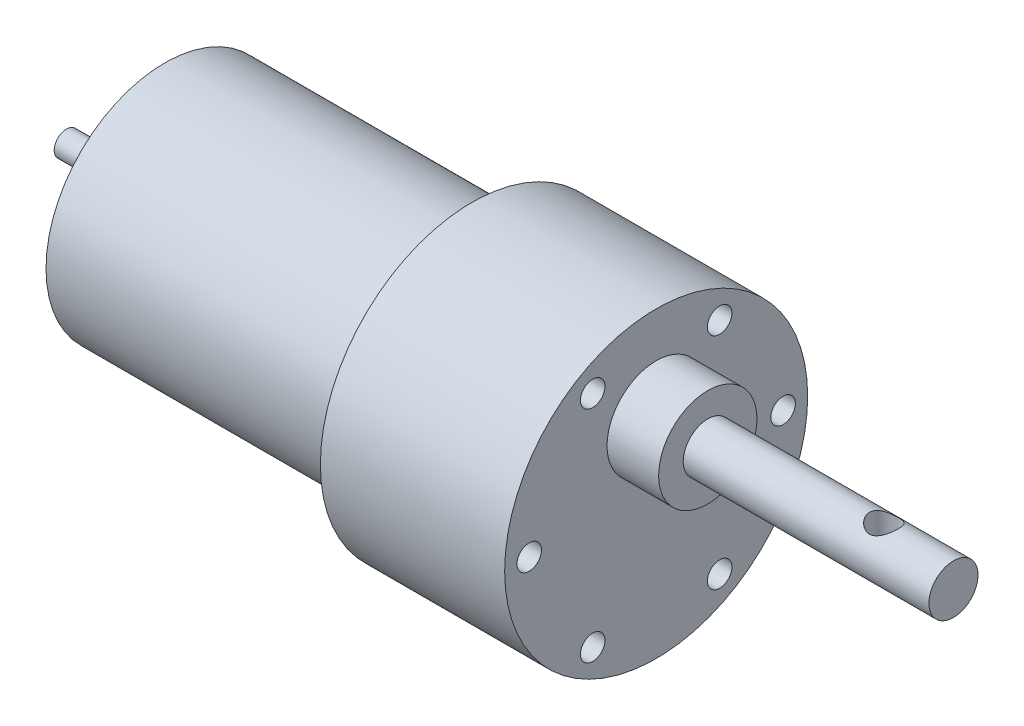
ISO-10303-21;
HEADER;
FILE_DESCRIPTION(('STEP AP214'),'2;1');
FILE_NAME('part.step','',(''),(''),'','','');
FILE_SCHEMA(('AUTOMOTIVE_DESIGN { 1 0 10303 214 1 1 1 1 }'));
ENDSEC;
DATA;
#1=APPLICATION_CONTEXT('core data for automotive mechanical design processes');
#2=APPLICATION_PROTOCOL_DEFINITION('international standard','automotive_design',2000,#1);
#3=PRODUCT_CONTEXT('',#1,'mechanical');
#4=PRODUCT('Part','Part','',(#3));
#5=PRODUCT_RELATED_PRODUCT_CATEGORY('part','',(#4));
#6=PRODUCT_DEFINITION_FORMATION('','',#4);
#7=PRODUCT_DEFINITION_CONTEXT('part definition',#1,'design');
#8=PRODUCT_DEFINITION('design','',#6,#7);
#9=PRODUCT_DEFINITION_SHAPE('','',#8);
#10=(LENGTH_UNIT() NAMED_UNIT(*) SI_UNIT(.MILLI.,.METRE.));
#11=(NAMED_UNIT(*) PLANE_ANGLE_UNIT() SI_UNIT($,.RADIAN.));
#12=(NAMED_UNIT(*) SI_UNIT($,.STERADIAN.) SOLID_ANGLE_UNIT());
#13=UNCERTAINTY_MEASURE_WITH_UNIT(LENGTH_MEASURE(1.E-05),#10,'distance_accuracy_value','');
#14=(GEOMETRIC_REPRESENTATION_CONTEXT(3) GLOBAL_UNCERTAINTY_ASSIGNED_CONTEXT((#13)) GLOBAL_UNIT_ASSIGNED_CONTEXT((#10,
#11,#12)) REPRESENTATION_CONTEXT('',''));
#15=CARTESIAN_POINT('',(0.,0.,0.));
#16=DIRECTION('',(0.,0.,1.));
#17=DIRECTION('',(1.,0.,0.));
#18=AXIS2_PLACEMENT_3D('',#15,#16,#17);
#19=CARTESIAN_POINT('',(60.,21.5,0.));
#20=DIRECTION('',(-1.,0.,0.));
#21=DIRECTION('',(0.,0.,1.));
#22=AXIS2_PLACEMENT_3D('',#19,#20,#21);
#23=CYLINDRICAL_SURFACE('',#22,3.);
#24=CARTESIAN_POINT('',(87.8,19.0633014137978,-1.75));
#25=CARTESIAN_POINT('',(87.7113611047185,19.0633017890819,-1.75000045184634));
#26=CARTESIAN_POINT('',(87.6227238943334,19.0583921153926,-1.74322391194511));
#27=CARTESIAN_POINT('',(87.4483908088206,19.0395960935827,-1.71658538535328));
#28=CARTESIAN_POINT('',(87.3626980615196,19.0257004925952,-1.69670991020086));
#29=CARTESIAN_POINT('',(87.1971287371694,18.9911318089616,-1.64515183199159));
#30=CARTESIAN_POINT('',(87.1172170416787,18.9705047545146,-1.61354922075016));
#31=CARTESIAN_POINT('',(86.9638699461855,18.9248800051478,-1.53968773008132));
#32=CARTESIAN_POINT('',(86.8904366298044,18.8998809117166,-1.4974254389569));
#33=CARTESIAN_POINT('',(86.7428708545941,18.8448528801408,-1.39777992638195));
#34=CARTESIAN_POINT('',(86.6696269495259,18.8145760254182,-1.33921745197901));
#35=CARTESIAN_POINT('',(86.5332708340349,18.7543928525755,-1.21105723337492));
#36=CARTESIAN_POINT('',(86.4701656336402,18.7244868039074,-1.14145191954029));
#37=CARTESIAN_POINT('',(86.3496347601438,18.6648550730515,-0.984713035802148));
#38=CARTESIAN_POINT('',(86.2934112475108,18.635447550753,-0.896522073845253));
#39=CARTESIAN_POINT('',(86.1970172490963,18.5835979485891,-0.709891668525843));
#40=CARTESIAN_POINT('',(86.15683290002,18.5611498571714,-0.611461168794447));
#41=CARTESIAN_POINT('',(86.0975604259412,18.5275831018999,-0.416649273147373));
#42=CARTESIAN_POINT('',(86.0768806782808,18.5156169180011,-0.320901861024325));
#43=CARTESIAN_POINT('',(86.051848297517,18.5010961478276,-0.126621897572968));
#44=CARTESIAN_POINT('',(86.0474813992985,18.4985333386087,-0.0280918555915921));
#45=CARTESIAN_POINT('',(86.0548563783502,18.5028302559847,0.156495068538422));
#46=CARTESIAN_POINT('',(86.0647672886593,18.5086191084485,0.242658294595015));
#47=CARTESIAN_POINT('',(86.0969735498551,18.5271855508756,0.411844523266138));
#48=CARTESIAN_POINT('',(86.119269814668,18.5399636565808,0.49486729366078));
#49=CARTESIAN_POINT('',(86.1754820877924,18.5715165817635,0.656364893028939));
#50=CARTESIAN_POINT('',(86.2094859948441,18.5903366890477,0.73479991025317));
#51=CARTESIAN_POINT('',(86.2878776098211,18.6324362422782,0.884967789919835));
#52=CARTESIAN_POINT('',(86.3322682310179,18.6557169390005,0.956698764094659));
#53=CARTESIAN_POINT('',(86.4359887503674,18.7079062582996,1.10031993041438));
#54=CARTESIAN_POINT('',(86.4964533298607,18.7371544076767,1.17126676062861));
#55=CARTESIAN_POINT('',(86.6276655505671,18.7965866031381,1.30259918374289));
#56=CARTESIAN_POINT('',(86.6984262853647,18.8267718018283,1.3629711098475));
#57=CARTESIAN_POINT('',(86.8571767463612,18.8883911597509,1.47789838153368));
#58=CARTESIAN_POINT('',(86.9461983710235,18.9196169266362,1.53115297544719));
#59=CARTESIAN_POINT('',(87.1339084828825,18.9754761260183,1.62161168095688));
#60=CARTESIAN_POINT('',(87.2325790824631,19.000121452516,1.65884482652416));
#61=CARTESIAN_POINT('',(87.4127659909169,19.0339141758281,1.7085372011066));
#62=CARTESIAN_POINT('',(87.4928115753789,19.0453495120544,1.72477506877111));
#63=CARTESIAN_POINT('',(87.6550824748154,19.0603272725384,1.74590213357921));
#64=CARTESIAN_POINT('',(87.7373054326581,19.0638779052461,1.75080313330495));
#65=CARTESIAN_POINT('',(87.9016212032816,19.0625694613086,1.74898039241038));
#66=CARTESIAN_POINT('',(87.9837138340858,19.0577028662383,1.74224625907734));
#67=CARTESIAN_POINT('',(88.1453621404304,19.0402647635416,1.71753388251395));
#68=CARTESIAN_POINT('',(88.2249158508094,19.0276874329025,1.69954714130061));
#69=CARTESIAN_POINT('',(88.3801869976751,18.9963472132362,1.65302928692431));
#70=CARTESIAN_POINT('',(88.4558724924044,18.9775402035061,1.62442278126808));
#71=CARTESIAN_POINT('',(88.601648943733,18.9357743594569,1.55765692699783));
#72=CARTESIAN_POINT('',(88.6717376750208,18.9128138854236,1.5194938033052));
#73=CARTESIAN_POINT('',(88.8171188563031,18.8605561050156,1.42709875316828));
#74=CARTESIAN_POINT('',(88.8912263899248,18.8308486609408,1.37123101284258));
#75=CARTESIAN_POINT('',(89.0297415156961,18.7712913902388,1.24852240970033));
#76=CARTESIAN_POINT('',(89.0941404266979,18.7414414605181,1.18167183667127));
#77=CARTESIAN_POINT('',(89.2186237055379,18.6810092845079,1.02989256043404));
#78=CARTESIAN_POINT('',(89.2774196858398,18.6507186109384,0.943778122538593));
#79=CARTESIAN_POINT('',(89.3793818001881,18.5965398403374,0.760910913608864));
#80=CARTESIAN_POINT('',(89.4225596345963,18.5726469538921,0.664166177419417));
#81=CARTESIAN_POINT('',(89.4883628925835,18.5356467791207,0.470674024896597));
#82=CARTESIAN_POINT('',(89.5123354536865,18.5218401339923,0.374522814239411));
#83=CARTESIAN_POINT('',(89.5436647397335,18.5037195278495,0.178706533702768));
#84=CARTESIAN_POINT('',(89.5510377761703,18.4993962481308,0.0790450111451346));
#85=CARTESIAN_POINT('',(89.5488661823514,18.5006599728325,-0.107655929988299));
#86=CARTESIAN_POINT('',(89.5412978970827,18.5050893081918,-0.194734538061878));
#87=CARTESIAN_POINT('',(89.5134701466853,18.5211830250589,-0.366137785941601));
#88=CARTESIAN_POINT('',(89.4932102055189,18.5328476779482,-0.450462322323408));
#89=CARTESIAN_POINT('',(89.441070466725,18.5622875850476,-0.613761582363568));
#90=CARTESIAN_POINT('',(89.4092520942239,18.580030509543,-0.692762016439768));
#91=CARTESIAN_POINT('',(89.3351444018639,18.6202083466169,-0.844368647802304));
#92=CARTESIAN_POINT('',(89.2928524566044,18.6426444354072,-0.916973235651938));
#93=CARTESIAN_POINT('',(89.1937651338791,18.6932103829172,-1.06230015031832));
#94=CARTESIAN_POINT('',(89.1358870507758,18.7216949422039,-1.13415977100245));
#95=CARTESIAN_POINT('',(89.0098860102852,18.7800361952813,-1.26772272997665));
#96=CARTESIAN_POINT('',(88.9417509945418,18.8098944749821,-1.32941393272294));
#97=CARTESIAN_POINT('',(88.7879891095944,18.8716721798105,-1.44805208639206));
#98=CARTESIAN_POINT('',(88.7012533588189,18.9034378224155,-1.50365362198231));
#99=CARTESIAN_POINT('',(88.5178650254964,18.961238990988,-1.59932168084081));
#100=CARTESIAN_POINT('',(88.4212248150765,18.9872815410429,-1.63940729371888));
#101=CARTESIAN_POINT('',(88.2376203962233,19.0256490413263,-1.69663483894556));
#102=CARTESIAN_POINT('',(88.1518579447994,19.0395643904676,-1.71653991344376));
#103=CARTESIAN_POINT('',(87.97739366802,19.058384286291,-1.74321337060432));
#104=CARTESIAN_POINT('',(87.8886959904762,19.0633010382719,-1.74999954786261));
#105=CARTESIAN_POINT('',(87.8,19.0633014137978,-1.75));
#106=B_SPLINE_CURVE_WITH_KNOTS('',3,(#24,#25,#26,#27,#28,#29,#30,#31,#32,#33,#34,#35,#36,#37,
#38,#39,#40,#41,#42,#43,#44,#45,#46,#47,#48,#49,#50,#51,#52,#53,#54,#55,#56,#57,#58,#59,#60,#61,
#62,#63,#64,#65,#66,#67,#68,#69,#70,#71,#72,#73,#74,#75,#76,#77,#78,#79,#80,#81,#82,#83,#84,#85,
#86,#87,#88,#89,#90,#91,#92,#93,#94,#95,#96,#97,#98,#99,#100,#101,#102,#103,#104,#105),
.UNSPECIFIED.,.T.,.F.,(4,2,2,2,2,2,2,2,2,2,2,2,2,2,2,2,2,2,2,2,2,2,2,2,2,2,2,2,2,2,2,2,2,2,2,2,
2,2,2,2,4),(0.,0.265545218763686,0.531364307474159,0.79540258776307,1.05952548262139,
1.35398659107802,1.64865042554403,1.972831424877,2.29673161156481,2.59104789961809,
2.88510675625998,3.14464340280144,3.40419920332161,3.66574779852171,3.92736984114419,
4.21928633023893,4.51157734664538,4.83494305243832,5.15772026336275,5.40406403188872,
5.65015122128838,5.89645833389883,6.14295168285398,6.39122950133273,6.63960555026166,
6.9307869180987,7.22222712635784,7.54626723053989,7.87006407425506,8.16844648867913,
8.46653556995419,8.72782114336878,8.98911651764956,9.24904312841218,9.50903496080324,
9.79757898950313,10.0864649272872,10.4083273312523,10.7297924718895,10.9958699008298,
11.2615861659037),.UNSPECIFIED.);
#107=CARTESIAN_POINT('',(87.8,19.0633014137978,-1.75));
#108=VERTEX_POINT('',#107);
#109=EDGE_CURVE('E63',#108,#108,#106,.T.);
#110=ORIENTED_EDGE('',*,*,#109,.T.);
#111=EDGE_LOOP('',(#110));
#112=FACE_BOUND('',#111,.T.);
#113=CARTESIAN_POINT('',(96.3,21.5,0.));
#114=DIRECTION('',(-1.,0.,0.));
#115=DIRECTION('',(0.,0.,1.));
#116=AXIS2_PLACEMENT_3D('',#113,#114,#115);
#117=CIRCLE('',#116,3.);
#118=CARTESIAN_POINT('',(96.3,21.5,3.));
#119=VERTEX_POINT('',#118);
#120=EDGE_CURVE('E151',#119,#119,#117,.T.);
#121=ORIENTED_EDGE('',*,*,#120,.T.);
#122=EDGE_LOOP('',(#121));
#123=FACE_BOUND('',#122,.T.);
#124=CARTESIAN_POINT('',(66.3,21.5,0.));
#125=DIRECTION('',(-1.,0.,0.));
#126=DIRECTION('',(0.,0.,1.));
#127=AXIS2_PLACEMENT_3D('',#124,#125,#126);
#128=CIRCLE('',#127,3.);
#129=CARTESIAN_POINT('',(66.3,21.5,3.));
#130=VERTEX_POINT('',#129);
#131=EDGE_CURVE('E154',#130,#130,#128,.T.);
#132=ORIENTED_EDGE('',*,*,#131,.F.);
#133=EDGE_LOOP('',(#132));
#134=FACE_BOUND('',#133,.T.);
#135=CARTESIAN_POINT('',(87.8,23.9366985862022,-1.75));
#136=CARTESIAN_POINT('',(87.8886388952814,23.9366982109181,-1.75000045184634));
#137=CARTESIAN_POINT('',(87.9772761056665,23.9416078846074,-1.74322391194511));
#138=CARTESIAN_POINT('',(88.1516091911793,23.9604039064173,-1.71658538535328));
#139=CARTESIAN_POINT('',(88.2373019384804,23.9742995074048,-1.69670991020086));
#140=CARTESIAN_POINT('',(88.4028712628305,24.0088681910384,-1.64515183199159));
#141=CARTESIAN_POINT('',(88.4827829583213,24.0294952454854,-1.61354922075016));
#142=CARTESIAN_POINT('',(88.6361300538145,24.0751199948522,-1.53968773008132));
#143=CARTESIAN_POINT('',(88.7095633701956,24.1001190882834,-1.4974254389569));
#144=CARTESIAN_POINT('',(88.8571291454058,24.1551471198592,-1.39777992638195));
#145=CARTESIAN_POINT('',(88.930373050474,24.1854239745818,-1.33921745197901));
#146=CARTESIAN_POINT('',(89.0667291659651,24.2456071474245,-1.21105723337492));
#147=CARTESIAN_POINT('',(89.1298343663598,24.2755131960926,-1.14145191954029));
#148=CARTESIAN_POINT('',(89.2503652398562,24.3351449269485,-0.984713035802146));
#149=CARTESIAN_POINT('',(89.3065887524892,24.364552449247,-0.896522073845249));
#150=CARTESIAN_POINT('',(89.4029827509037,24.4164020514109,-0.709891668525838));
#151=CARTESIAN_POINT('',(89.44316709998,24.4388501428286,-0.611461168794444));
#152=CARTESIAN_POINT('',(89.5024395740588,24.4724168981001,-0.416649273147373));
#153=CARTESIAN_POINT('',(89.5231193217192,24.4843830819989,-0.320901861024325));
#154=CARTESIAN_POINT('',(89.548151702483,24.4989038521724,-0.126621897572968));
#155=CARTESIAN_POINT('',(89.5525186007014,24.5014666613913,-0.0280918555915919));
#156=CARTESIAN_POINT('',(89.5451436216498,24.4971697440153,0.156495068538421));
#157=CARTESIAN_POINT('',(89.5352327113407,24.4913808915515,0.242658294595013));
#158=CARTESIAN_POINT('',(89.5030264501449,24.4728144491244,0.411844523266136));
#159=CARTESIAN_POINT('',(89.480730185332,24.4600363434192,0.494867293660779));
#160=CARTESIAN_POINT('',(89.4245179122076,24.4284834182365,0.656364893028939));
#161=CARTESIAN_POINT('',(89.3905140051559,24.4096633109523,0.73479991025317));
#162=CARTESIAN_POINT('',(89.3121223901789,24.3675637577218,0.884967789919835));
#163=CARTESIAN_POINT('',(89.267731768982,24.3442830609995,0.956698764094659));
#164=CARTESIAN_POINT('',(89.1640112496325,24.2920937417004,1.10031993041438));
#165=CARTESIAN_POINT('',(89.1035466701393,24.2628455923233,1.17126676062861));
#166=CARTESIAN_POINT('',(88.9723344494329,24.2034133968619,1.30259918374289));
#167=CARTESIAN_POINT('',(88.9015737146353,24.1732281981717,1.3629711098475));
#168=CARTESIAN_POINT('',(88.7428232536387,24.1116088402491,1.47789838153368));
#169=CARTESIAN_POINT('',(88.6538016289764,24.0803830733638,1.5311529754472));
#170=CARTESIAN_POINT('',(88.4660915171175,24.0245238739817,1.62161168095689));
#171=CARTESIAN_POINT('',(88.3674209175368,23.999878547484,1.65884482652416));
#172=CARTESIAN_POINT('',(88.1872340090831,23.9660858241719,1.7085372011066));
#173=CARTESIAN_POINT('',(88.1071884246211,23.9546504879456,1.72477506877111));
#174=CARTESIAN_POINT('',(87.9449175251846,23.9396727274616,1.74590213357921));
#175=CARTESIAN_POINT('',(87.8626945673419,23.9361220947539,1.75080313330495));
#176=CARTESIAN_POINT('',(87.6983787967184,23.9374305386914,1.74898039241038));
#177=CARTESIAN_POINT('',(87.6162861659141,23.9422971337617,1.74224625907734));
#178=CARTESIAN_POINT('',(87.4546378595696,23.9597352364584,1.71753388251395));
#179=CARTESIAN_POINT('',(87.3750841491906,23.9723125670975,1.69954714130061));
#180=CARTESIAN_POINT('',(87.2198130023249,24.0036527867638,1.65302928692431));
#181=CARTESIAN_POINT('',(87.1441275075956,24.0224597964939,1.62442278126808));
#182=CARTESIAN_POINT('',(86.998351056267,24.0642256405431,1.55765692699783));
#183=CARTESIAN_POINT('',(86.9282623249792,24.0871861145764,1.5194938033052));
#184=CARTESIAN_POINT('',(86.7828811436969,24.1394438949844,1.42709875316828));
#185=CARTESIAN_POINT('',(86.7087736100751,24.1691513390592,1.37123101284257));
#186=CARTESIAN_POINT('',(86.5702584843039,24.2287086097612,1.24852240970033));
#187=CARTESIAN_POINT('',(86.5058595733021,24.2585585394819,1.18167183667127));
#188=CARTESIAN_POINT('',(86.3813762944621,24.3189907154921,1.02989256043404));
#189=CARTESIAN_POINT('',(86.3225803141602,24.3492813890616,0.943778122538593));
#190=CARTESIAN_POINT('',(86.2206181998119,24.4034601596626,0.760910913608864));
#191=CARTESIAN_POINT('',(86.1774403654037,24.4273530461079,0.664166177419417));
#192=CARTESIAN_POINT('',(86.1116371074164,24.4643532208793,0.470674024896597));
#193=CARTESIAN_POINT('',(86.0876645463135,24.4781598660077,0.374522814239411));
#194=CARTESIAN_POINT('',(86.0563352602665,24.4962804721505,0.178706533702768));
#195=CARTESIAN_POINT('',(86.0489622238297,24.5006037518692,0.0790450111451347));
#196=CARTESIAN_POINT('',(86.0511338176486,24.4993400271675,-0.107655929988299));
#197=CARTESIAN_POINT('',(86.0587021029173,24.4949106918082,-0.194734538061879));
#198=CARTESIAN_POINT('',(86.0865298533147,24.4788169749411,-0.366137785941602));
#199=CARTESIAN_POINT('',(86.1067897944811,24.4671523220518,-0.450462322323407));
#200=CARTESIAN_POINT('',(86.1589295332749,24.4377124149524,-0.613761582363566));
#201=CARTESIAN_POINT('',(86.1907479057761,24.419969490457,-0.692762016439766));
#202=CARTESIAN_POINT('',(86.2648555981361,24.3797916533831,-0.844368647802302));
#203=CARTESIAN_POINT('',(86.3071475433956,24.3573555645928,-0.916973235651936));
#204=CARTESIAN_POINT('',(86.4062348661209,24.3067896170828,-1.06230015031832));
#205=CARTESIAN_POINT('',(86.4641129492242,24.2783050577961,-1.13415977100245));
#206=CARTESIAN_POINT('',(86.5901139897148,24.2199638047187,-1.26772272997665));
#207=CARTESIAN_POINT('',(86.6582490054582,24.1901055250179,-1.32941393272294));
#208=CARTESIAN_POINT('',(86.8120108904055,24.1283278201895,-1.44805208639206));
#209=CARTESIAN_POINT('',(86.8987466411811,24.0965621775845,-1.50365362198231));
#210=CARTESIAN_POINT('',(87.0821349745036,24.038761009012,-1.59932168084081));
#211=CARTESIAN_POINT('',(87.1787751849235,24.0127184589572,-1.63940729371888));
#212=CARTESIAN_POINT('',(87.3623796037767,23.9743509586737,-1.69663483894556));
#213=CARTESIAN_POINT('',(87.4481420552006,23.9604356095324,-1.71653991344376));
#214=CARTESIAN_POINT('',(87.6226063319799,23.941615713709,-1.74321337060432));
#215=CARTESIAN_POINT('',(87.7113040095238,23.9366989617281,-1.74999954786261));
#216=CARTESIAN_POINT('',(87.8,23.9366985862022,-1.75));
#217=B_SPLINE_CURVE_WITH_KNOTS('',3,(#135,#136,#137,#138,#139,#140,#141,#142,#143,#144,#145,
#146,#147,#148,#149,#150,#151,#152,#153,#154,#155,#156,#157,#158,#159,#160,#161,#162,#163,#164,
#165,#166,#167,#168,#169,#170,#171,#172,#173,#174,#175,#176,#177,#178,#179,#180,#181,#182,#183,
#184,#185,#186,#187,#188,#189,#190,#191,#192,#193,#194,#195,#196,#197,#198,#199,#200,#201,#202,
#203,#204,#205,#206,#207,#208,#209,#210,#211,#212,#213,#214,#215,#216),.UNSPECIFIED.,.T.,.F.,(4,
2,2,2,2,2,2,2,2,2,2,2,2,2,2,2,2,2,2,2,2,2,2,2,2,2,2,2,2,2,2,2,2,2,2,2,2,2,2,2,4),(0.,
0.265545218763686,0.531364307474159,0.79540258776307,1.05952548262139,1.35398659107802,
1.64865042554403,1.97283142487701,2.29673161156481,2.59104789961809,2.88510675625998,
3.14464340280144,3.40419920332161,3.66574779852171,3.92736984114419,4.21928633023893,
4.51157734664538,4.83494305243835,5.15772026336275,5.40406403188872,5.65015122128838,
5.89645833389883,6.14295168285398,6.39122950133273,6.63960555026166,6.93078691809872,
7.22222712635784,7.54626723053989,7.87006407425506,8.16844648867913,8.46653556995419,
8.72782114336878,8.98911651764956,9.24904312841217,9.50903496080324,9.79757898950313,
10.0864649272872,10.4083273312523,10.7297924718895,10.9958699008298,11.2615861659037),.UNSPECIFIED.);
#218=CARTESIAN_POINT('',(87.8,23.9366985862022,-1.75));
#219=VERTEX_POINT('',#218);
#220=EDGE_CURVE('E46',#219,#219,#217,.T.);
#221=ORIENTED_EDGE('',*,*,#220,.T.);
#222=EDGE_LOOP('',(#221));
#223=FACE_BOUND('',#222,.T.);
#224=ADVANCED_FACE('F42',(#112,#123,#134,#223),#23,.T.);
#225=CARTESIAN_POINT('',(-3.,0.,0.));
#226=DIRECTION('',(1.,0.,0.));
#227=DIRECTION('',(0.,0.,-1.));
#228=AXIS2_PLACEMENT_3D('',#225,#226,#227);
#229=PLANE('',#228);
#230=CARTESIAN_POINT('',(-3.,14.5,0.));
#231=DIRECTION('',(-1.,0.,0.));
#232=DIRECTION('',(0.,0.,1.));
#233=AXIS2_PLACEMENT_3D('',#230,#231,#232);
#234=CIRCLE('',#233,1.5);
#235=CARTESIAN_POINT('',(-3.,14.5,1.5));
#236=VERTEX_POINT('',#235);
#237=EDGE_CURVE('E55',#236,#236,#234,.T.);
#238=ORIENTED_EDGE('',*,*,#237,.F.);
#239=EDGE_LOOP('',(#238));
#240=FACE_BOUND('',#239,.T.);
#241=CARTESIAN_POINT('',(-3.,14.5,0.));
#242=DIRECTION('',(-1.,0.,0.));
#243=DIRECTION('',(0.,0.,1.));
#244=AXIS2_PLACEMENT_3D('',#241,#242,#243);
#245=CIRCLE('',#244,5.);
#246=CARTESIAN_POINT('',(-3.,14.5,5.));
#247=VERTEX_POINT('',#246);
#248=EDGE_CURVE('E198',#247,#247,#245,.T.);
#249=ORIENTED_EDGE('',*,*,#248,.T.);
#250=EDGE_LOOP('',(#249));
#251=FACE_BOUND('',#250,.T.);
#252=ADVANCED_FACE('F44',(#240,#251),#229,.F.);
#253=CARTESIAN_POINT('',(-31.2668718651561,14.5,0.));
#254=DIRECTION('',(-1.,0.,0.));
#255=DIRECTION('',(0.,0.,1.));
#256=AXIS2_PLACEMENT_3D('',#253,#254,#255);
#257=CYLINDRICAL_SURFACE('',#256,1.5);
#258=CARTESIAN_POINT('',(-12.,14.5,0.));
#259=DIRECTION('',(-1.,0.,0.));
#260=DIRECTION('',(0.,0.,1.));
#261=AXIS2_PLACEMENT_3D('',#258,#259,#260);
#262=CIRCLE('',#261,1.5);
#263=CARTESIAN_POINT('',(-12.,14.5,1.5));
#264=VERTEX_POINT('',#263);
#265=EDGE_CURVE('E60',#264,#264,#262,.T.);
#266=ORIENTED_EDGE('',*,*,#265,.F.);
#267=EDGE_LOOP('',(#266));
#268=FACE_BOUND('',#267,.T.);
#269=ORIENTED_EDGE('',*,*,#237,.T.);
#270=EDGE_LOOP('',(#269));
#271=FACE_BOUND('',#270,.T.);
#272=ADVANCED_FACE('F144',(#268,#271),#257,.T.);
#273=CARTESIAN_POINT('',(-12.,0.,0.));
#274=DIRECTION('',(1.,0.,0.));
#275=DIRECTION('',(0.,0.,-1.));
#276=AXIS2_PLACEMENT_3D('',#273,#274,#275);
#277=PLANE('',#276);
#278=ORIENTED_EDGE('',*,*,#265,.T.);
#279=EDGE_LOOP('',(#278));
#280=FACE_BOUND('',#279,.T.);
#281=ADVANCED_FACE('F218',(#280),#277,.F.);
#282=CARTESIAN_POINT('',(60.,0.,0.));
#283=DIRECTION('',(1.,0.,0.));
#284=DIRECTION('',(0.,0.,-1.));
#285=AXIS2_PLACEMENT_3D('',#282,#283,#284);
#286=PLANE('',#285);
#287=CARTESIAN_POINT('',(60.,14.5,15.5));
#288=DIRECTION('',(1.,0.,0.));
#289=DIRECTION('',(0.,0.,-1.));
#290=AXIS2_PLACEMENT_3D('',#287,#288,#289);
#291=CIRCLE('',#290,1.5);
#292=CARTESIAN_POINT('',(60.,14.5,14.));
#293=VERTEX_POINT('',#292);
#294=EDGE_CURVE('E171',#293,#293,#291,.T.);
#295=ORIENTED_EDGE('',*,*,#294,.F.);
#296=EDGE_LOOP('',(#295));
#297=FACE_BOUND('',#296,.T.);
#298=CARTESIAN_POINT('',(60.,1.07660624134129,7.75000000000016));
#299=DIRECTION('',(1.,0.,0.));
#300=DIRECTION('',(0.,0.,-1.));
#301=AXIS2_PLACEMENT_3D('',#298,#299,#300);
#302=CIRCLE('',#301,1.5);
#303=CARTESIAN_POINT('',(60.,1.07660624134129,6.25000000000016));
#304=VERTEX_POINT('',#303);
#305=EDGE_CURVE('E157',#304,#304,#302,.T.);
#306=ORIENTED_EDGE('',*,*,#305,.F.);
#307=EDGE_LOOP('',(#306));
#308=FACE_BOUND('',#307,.T.);
#309=CARTESIAN_POINT('',(60.,1.07660624134114,-7.74999999999988));
#310=DIRECTION('',(1.,0.,0.));
#311=DIRECTION('',(0.,0.,-1.));
#312=AXIS2_PLACEMENT_3D('',#309,#310,#311);
#313=CIRCLE('',#312,1.5);
#314=CARTESIAN_POINT('',(60.,1.07660624134114,-9.24999999999988));
#315=VERTEX_POINT('',#314);
#316=EDGE_CURVE('E164',#315,#315,#313,.T.);
#317=ORIENTED_EDGE('',*,*,#316,.F.);
#318=EDGE_LOOP('',(#317));
#319=FACE_BOUND('',#318,.T.);
#320=CARTESIAN_POINT('',(60.,14.4999999999999,-15.5));
#321=DIRECTION('',(1.,0.,0.));
#322=DIRECTION('',(0.,0.,-1.));
#323=AXIS2_PLACEMENT_3D('',#320,#321,#322);
#324=CIRCLE('',#323,1.5);
#325=CARTESIAN_POINT('',(60.,14.4999999999999,-17.));
#326=VERTEX_POINT('',#325);
#327=EDGE_CURVE('E184',#326,#326,#324,.T.);
#328=ORIENTED_EDGE('',*,*,#327,.F.);
#329=EDGE_LOOP('',(#328));
#330=FACE_BOUND('',#329,.T.);
#331=CARTESIAN_POINT('',(60.,27.9233937586588,-7.75000000000006));
#332=DIRECTION('',(1.,0.,0.));
#333=DIRECTION('',(0.,0.,-1.));
#334=AXIS2_PLACEMENT_3D('',#331,#332,#333);
#335=CIRCLE('',#334,1.5);
#336=CARTESIAN_POINT('',(60.,27.9233937586588,-9.25000000000006));
#337=VERTEX_POINT('',#336);
#338=EDGE_CURVE('E178',#337,#337,#335,.T.);
#339=ORIENTED_EDGE('',*,*,#338,.F.);
#340=EDGE_LOOP('',(#339));
#341=FACE_BOUND('',#340,.T.);
#342=CARTESIAN_POINT('',(60.,27.9233937586588,7.74999999999997));
#343=DIRECTION('',(1.,0.,0.));
#344=DIRECTION('',(0.,0.,-1.));
#345=AXIS2_PLACEMENT_3D('',#342,#343,#344);
#346=CIRCLE('',#345,1.5);
#347=CARTESIAN_POINT('',(60.,27.9233937586588,6.24999999999997));
#348=VERTEX_POINT('',#347);
#349=EDGE_CURVE('E172',#348,#348,#346,.T.);
#350=ORIENTED_EDGE('',*,*,#349,.F.);
#351=EDGE_LOOP('',(#350));
#352=FACE_BOUND('',#351,.T.);
#353=CARTESIAN_POINT('',(60.,21.5,0.));
#354=DIRECTION('',(1.,0.,0.));
#355=DIRECTION('',(0.,0.,-1.));
#356=AXIS2_PLACEMENT_3D('',#353,#354,#355);
#357=CIRCLE('',#356,6.);
#358=CARTESIAN_POINT('',(60.,21.5,-6.));
#359=VERTEX_POINT('',#358);
#360=EDGE_CURVE('E10',#359,#359,#357,.T.);
#361=ORIENTED_EDGE('',*,*,#360,.F.);
#362=EDGE_LOOP('',(#361));
#363=FACE_BOUND('',#362,.T.);
#364=CARTESIAN_POINT('',(60.,14.5,0.));
#365=DIRECTION('',(-1.,0.,0.));
#366=DIRECTION('',(0.,0.,1.));
#367=AXIS2_PLACEMENT_3D('',#364,#365,#366);
#368=CIRCLE('',#367,18.5);
#369=CARTESIAN_POINT('',(60.,14.5,18.5));
#370=VERTEX_POINT('',#369);
#371=EDGE_CURVE('E213',#370,#370,#368,.T.);
#372=ORIENTED_EDGE('',*,*,#371,.F.);
#373=EDGE_LOOP('',(#372));
#374=FACE_BOUND('',#373,.T.);
#375=ADVANCED_FACE('F249',(#297,#308,#319,#330,#341,#352,#363,#374),#286,.T.);
#376=CARTESIAN_POINT('',(-31.2668718651561,14.5,0.));
#377=DIRECTION('',(-1.,0.,0.));
#378=DIRECTION('',(0.,0.,1.));
#379=AXIS2_PLACEMENT_3D('',#376,#377,#378);
#380=CYLINDRICAL_SURFACE('',#379,18.5);
#381=ORIENTED_EDGE('',*,*,#371,.T.);
#382=EDGE_LOOP('',(#381));
#383=FACE_BOUND('',#382,.T.);
#384=CARTESIAN_POINT('',(37.5,14.5,0.));
#385=DIRECTION('',(-1.,0.,0.));
#386=DIRECTION('',(0.,0.,1.));
#387=AXIS2_PLACEMENT_3D('',#384,#385,#386);
#388=CIRCLE('',#387,18.5);
#389=CARTESIAN_POINT('',(37.5,14.5,18.5));
#390=VERTEX_POINT('',#389);
#391=EDGE_CURVE('E210',#390,#390,#388,.T.);
#392=ORIENTED_EDGE('',*,*,#391,.F.);
#393=EDGE_LOOP('',(#392));
#394=FACE_BOUND('',#393,.T.);
#395=ADVANCED_FACE('F245',(#383,#394),#380,.T.);
#396=CARTESIAN_POINT('',(37.5,0.,0.));
#397=DIRECTION('',(-1.,0.,0.));
#398=DIRECTION('',(0.,0.,1.));
#399=AXIS2_PLACEMENT_3D('',#396,#397,#398);
#400=PLANE('',#399);
#401=ORIENTED_EDGE('',*,*,#391,.T.);
#402=EDGE_LOOP('',(#401));
#403=FACE_BOUND('',#402,.T.);
#404=CARTESIAN_POINT('',(37.5,14.5,0.));
#405=DIRECTION('',(-1.,0.,0.));
#406=DIRECTION('',(0.,0.,1.));
#407=AXIS2_PLACEMENT_3D('',#404,#405,#406);
#408=CIRCLE('',#407,14.5);
#409=CARTESIAN_POINT('',(37.5,14.5,14.5));
#410=VERTEX_POINT('',#409);
#411=EDGE_CURVE('E207',#410,#410,#408,.T.);
#412=ORIENTED_EDGE('',*,*,#411,.F.);
#413=EDGE_LOOP('',(#412));
#414=FACE_BOUND('',#413,.T.);
#415=ADVANCED_FACE('F239',(#403,#414),#400,.T.);
#416=CARTESIAN_POINT('',(-31.2668718651561,14.5,0.));
#417=DIRECTION('',(-1.,0.,0.));
#418=DIRECTION('',(0.,0.,1.));
#419=AXIS2_PLACEMENT_3D('',#416,#417,#418);
#420=CYLINDRICAL_SURFACE('',#419,14.5);
#421=ORIENTED_EDGE('',*,*,#411,.T.);
#422=EDGE_LOOP('',(#421));
#423=FACE_BOUND('',#422,.T.);
#424=CARTESIAN_POINT('',(0.,14.5,0.));
#425=DIRECTION('',(-1.,0.,0.));
#426=DIRECTION('',(0.,0.,1.));
#427=AXIS2_PLACEMENT_3D('',#424,#425,#426);
#428=CIRCLE('',#427,14.5);
#429=CARTESIAN_POINT('',(0.,14.5,14.5));
#430=VERTEX_POINT('',#429);
#431=EDGE_CURVE('E204',#430,#430,#428,.T.);
#432=ORIENTED_EDGE('',*,*,#431,.F.);
#433=EDGE_LOOP('',(#432));
#434=FACE_BOUND('',#433,.T.);
#435=ADVANCED_FACE('F233',(#423,#434),#420,.T.);
#436=CARTESIAN_POINT('',(0.,0.,0.));
#437=DIRECTION('',(-1.,0.,0.));
#438=DIRECTION('',(0.,0.,1.));
#439=AXIS2_PLACEMENT_3D('',#436,#437,#438);
#440=PLANE('',#439);
#441=ORIENTED_EDGE('',*,*,#431,.T.);
#442=EDGE_LOOP('',(#441));
#443=FACE_BOUND('',#442,.T.);
#444=CARTESIAN_POINT('',(0.,14.5,0.));
#445=DIRECTION('',(-1.,0.,0.));
#446=DIRECTION('',(0.,0.,1.));
#447=AXIS2_PLACEMENT_3D('',#444,#445,#446);
#448=CIRCLE('',#447,5.);
#449=CARTESIAN_POINT('',(0.,14.5,5.));
#450=VERTEX_POINT('',#449);
#451=EDGE_CURVE('E201',#450,#450,#448,.T.);
#452=ORIENTED_EDGE('',*,*,#451,.F.);
#453=EDGE_LOOP('',(#452));
#454=FACE_BOUND('',#453,.T.);
#455=ADVANCED_FACE('F228',(#443,#454),#440,.T.);
#456=CARTESIAN_POINT('',(-31.2668718651561,14.5,0.));
#457=DIRECTION('',(-1.,0.,0.));
#458=DIRECTION('',(0.,0.,1.));
#459=AXIS2_PLACEMENT_3D('',#456,#457,#458);
#460=CYLINDRICAL_SURFACE('',#459,5.);
#461=ORIENTED_EDGE('',*,*,#248,.F.);
#462=EDGE_LOOP('',(#461));
#463=FACE_BOUND('',#462,.T.);
#464=ORIENTED_EDGE('',*,*,#451,.T.);
#465=EDGE_LOOP('',(#464));
#466=FACE_BOUND('',#465,.T.);
#467=ADVANCED_FACE('F135',(#463,#466),#460,.T.);
#468=CARTESIAN_POINT('',(96.3,0.,0.));
#469=DIRECTION('',(1.,0.,0.));
#470=DIRECTION('',(0.,0.,-1.));
#471=AXIS2_PLACEMENT_3D('',#468,#469,#470);
#472=PLANE('',#471);
#473=ORIENTED_EDGE('',*,*,#120,.F.);
#474=EDGE_LOOP('',(#473));
#475=FACE_BOUND('',#474,.T.);
#476=ADVANCED_FACE('F130',(#475),#472,.T.);
#477=CARTESIAN_POINT('',(66.3,0.,0.));
#478=DIRECTION('',(1.,0.,0.));
#479=DIRECTION('',(0.,0.,-1.));
#480=AXIS2_PLACEMENT_3D('',#477,#478,#479);
#481=PLANE('',#480);
#482=ORIENTED_EDGE('',*,*,#131,.T.);
#483=EDGE_LOOP('',(#482));
#484=FACE_BOUND('',#483,.T.);
#485=CARTESIAN_POINT('',(66.3,21.5,0.));
#486=DIRECTION('',(-1.,0.,0.));
#487=DIRECTION('',(0.,0.,1.));
#488=AXIS2_PLACEMENT_3D('',#485,#486,#487);
#489=CIRCLE('',#488,6.);
#490=CARTESIAN_POINT('',(66.3,21.5,6.));
#491=VERTEX_POINT('',#490);
#492=EDGE_CURVE('E192',#491,#491,#489,.T.);
#493=ORIENTED_EDGE('',*,*,#492,.F.);
#494=EDGE_LOOP('',(#493));
#495=FACE_BOUND('',#494,.T.);
#496=ADVANCED_FACE('F127',(#484,#495),#481,.T.);
#497=CARTESIAN_POINT('',(60.,21.5,0.));
#498=DIRECTION('',(-1.,0.,0.));
#499=DIRECTION('',(0.,0.,1.));
#500=AXIS2_PLACEMENT_3D('',#497,#498,#499);
#501=CYLINDRICAL_SURFACE('',#500,6.);
#502=ORIENTED_EDGE('',*,*,#492,.T.);
#503=EDGE_LOOP('',(#502));
#504=FACE_BOUND('',#503,.T.);
#505=ORIENTED_EDGE('',*,*,#360,.T.);
#506=EDGE_LOOP('',(#505));
#507=FACE_BOUND('',#506,.T.);
#508=ADVANCED_FACE('F102',(#504,#507),#501,.T.);
#509=CARTESIAN_POINT('',(56.5,27.9233937586588,7.74999999999997));
#510=DIRECTION('',(1.,0.,0.));
#511=DIRECTION('',(0.,0.,-1.));
#512=AXIS2_PLACEMENT_3D('',#509,#510,#511);
#513=CYLINDRICAL_SURFACE('',#512,1.5);
#514=CARTESIAN_POINT('',(56.5,27.9233937586588,7.74999999999997));
#515=DIRECTION('',(1.,0.,0.));
#516=DIRECTION('',(0.,0.,-1.));
#517=AXIS2_PLACEMENT_3D('',#514,#515,#516);
#518=CIRCLE('',#517,1.5);
#519=CARTESIAN_POINT('',(56.5,27.9233937586588,6.24999999999997));
#520=VERTEX_POINT('',#519);
#521=EDGE_CURVE('E168',#520,#520,#518,.T.);
#522=ORIENTED_EDGE('',*,*,#521,.F.);
#523=EDGE_LOOP('',(#522));
#524=FACE_BOUND('',#523,.T.);
#525=ORIENTED_EDGE('',*,*,#349,.T.);
#526=EDGE_LOOP('',(#525));
#527=FACE_BOUND('',#526,.T.);
#528=ADVANCED_FACE('F98',(#524,#527),#513,.F.);
#529=CARTESIAN_POINT('',(56.5,27.9233937586588,7.74999999999997));
#530=DIRECTION('',(1.,0.,0.));
#531=DIRECTION('',(0.,0.,-1.));
#532=AXIS2_PLACEMENT_3D('',#529,#530,#531);
#533=PLANE('',#532);
#534=ORIENTED_EDGE('',*,*,#521,.T.);
#535=EDGE_LOOP('',(#534));
#536=FACE_BOUND('',#535,.T.);
#537=ADVANCED_FACE('F94',(#536),#533,.T.);
#538=CARTESIAN_POINT('',(56.5,27.9233937586588,-7.75000000000006));
#539=DIRECTION('',(1.,0.,0.));
#540=DIRECTION('',(0.,0.,-1.));
#541=AXIS2_PLACEMENT_3D('',#538,#539,#540);
#542=CYLINDRICAL_SURFACE('',#541,1.5);
#543=CARTESIAN_POINT('',(56.5,27.9233937586588,-7.75000000000006));
#544=DIRECTION('',(1.,0.,0.));
#545=DIRECTION('',(0.,0.,-1.));
#546=AXIS2_PLACEMENT_3D('',#543,#544,#545);
#547=CIRCLE('',#546,1.5);
#548=CARTESIAN_POINT('',(56.5,27.9233937586588,-9.25000000000006));
#549=VERTEX_POINT('',#548);
#550=EDGE_CURVE('E175',#549,#549,#547,.T.);
#551=ORIENTED_EDGE('',*,*,#550,.F.);
#552=EDGE_LOOP('',(#551));
#553=FACE_BOUND('',#552,.T.);
#554=ORIENTED_EDGE('',*,*,#338,.T.);
#555=EDGE_LOOP('',(#554));
#556=FACE_BOUND('',#555,.T.);
#557=ADVANCED_FACE('F97',(#553,#556),#542,.F.);
#558=CARTESIAN_POINT('',(56.5,27.9233937586588,-7.75000000000006));
#559=DIRECTION('',(1.,0.,0.));
#560=DIRECTION('',(0.,0.,-1.));
#561=AXIS2_PLACEMENT_3D('',#558,#559,#560);
#562=PLANE('',#561);
#563=ORIENTED_EDGE('',*,*,#550,.T.);
#564=EDGE_LOOP('',(#563));
#565=FACE_BOUND('',#564,.T.);
#566=ADVANCED_FACE('F104',(#565),#562,.T.);
#567=CARTESIAN_POINT('',(56.5,14.4999999999999,-15.5));
#568=DIRECTION('',(1.,0.,0.));
#569=DIRECTION('',(0.,0.,-1.));
#570=AXIS2_PLACEMENT_3D('',#567,#568,#569);
#571=CYLINDRICAL_SURFACE('',#570,1.5);
#572=CARTESIAN_POINT('',(56.5,14.4999999999999,-15.5));
#573=DIRECTION('',(1.,0.,0.));
#574=DIRECTION('',(0.,0.,-1.));
#575=AXIS2_PLACEMENT_3D('',#572,#573,#574);
#576=CIRCLE('',#575,1.5);
#577=CARTESIAN_POINT('',(56.5,14.4999999999999,-17.));
#578=VERTEX_POINT('',#577);
#579=EDGE_CURVE('E181',#578,#578,#576,.T.);
#580=ORIENTED_EDGE('',*,*,#579,.F.);
#581=EDGE_LOOP('',(#580));
#582=FACE_BOUND('',#581,.T.);
#583=ORIENTED_EDGE('',*,*,#327,.T.);
#584=EDGE_LOOP('',(#583));
#585=FACE_BOUND('',#584,.T.);
#586=ADVANCED_FACE('F107',(#582,#585),#571,.F.);
#587=CARTESIAN_POINT('',(56.5,14.4999999999999,-15.5));
#588=DIRECTION('',(1.,0.,0.));
#589=DIRECTION('',(0.,0.,-1.));
#590=AXIS2_PLACEMENT_3D('',#587,#588,#589);
#591=PLANE('',#590);
#592=ORIENTED_EDGE('',*,*,#579,.T.);
#593=EDGE_LOOP('',(#592));
#594=FACE_BOUND('',#593,.T.);
#595=ADVANCED_FACE('F112',(#594),#591,.T.);
#596=CARTESIAN_POINT('',(56.5,1.07660624134114,-7.74999999999988));
#597=DIRECTION('',(1.,0.,0.));
#598=DIRECTION('',(0.,0.,-1.));
#599=AXIS2_PLACEMENT_3D('',#596,#597,#598);
#600=CYLINDRICAL_SURFACE('',#599,1.5);
#601=CARTESIAN_POINT('',(56.5,1.07660624134114,-7.74999999999988));
#602=DIRECTION('',(1.,0.,0.));
#603=DIRECTION('',(0.,0.,-1.));
#604=AXIS2_PLACEMENT_3D('',#601,#602,#603);
#605=CIRCLE('',#604,1.5);
#606=CARTESIAN_POINT('',(56.5,1.07660624134114,-9.24999999999988));
#607=VERTEX_POINT('',#606);
#608=EDGE_CURVE('E187',#607,#607,#605,.T.);
#609=ORIENTED_EDGE('',*,*,#608,.F.);
#610=EDGE_LOOP('',(#609));
#611=FACE_BOUND('',#610,.T.);
#612=ORIENTED_EDGE('',*,*,#316,.T.);
#613=EDGE_LOOP('',(#612));
#614=FACE_BOUND('',#613,.T.);
#615=ADVANCED_FACE('F115',(#611,#614),#600,.F.);
#616=CARTESIAN_POINT('',(56.5,1.07660624134114,-7.74999999999988));
#617=DIRECTION('',(1.,0.,0.));
#618=DIRECTION('',(0.,0.,-1.));
#619=AXIS2_PLACEMENT_3D('',#616,#617,#618);
#620=PLANE('',#619);
#621=ORIENTED_EDGE('',*,*,#608,.T.);
#622=EDGE_LOOP('',(#621));
#623=FACE_BOUND('',#622,.T.);
#624=ADVANCED_FACE('F92',(#623),#620,.T.);
#625=CARTESIAN_POINT('',(56.5,1.07660624134129,7.75000000000016));
#626=DIRECTION('',(1.,0.,0.));
#627=DIRECTION('',(0.,0.,-1.));
#628=AXIS2_PLACEMENT_3D('',#625,#626,#627);
#629=CYLINDRICAL_SURFACE('',#628,1.5);
#630=CARTESIAN_POINT('',(56.5,1.07660624134129,7.75000000000016));
#631=DIRECTION('',(1.,0.,0.));
#632=DIRECTION('',(0.,0.,-1.));
#633=AXIS2_PLACEMENT_3D('',#630,#631,#632);
#634=CIRCLE('',#633,1.5);
#635=CARTESIAN_POINT('',(56.5,1.07660624134129,6.25000000000016));
#636=VERTEX_POINT('',#635);
#637=EDGE_CURVE('E159',#636,#636,#634,.T.);
#638=ORIENTED_EDGE('',*,*,#637,.F.);
#639=EDGE_LOOP('',(#638));
#640=FACE_BOUND('',#639,.T.);
#641=ORIENTED_EDGE('',*,*,#305,.T.);
#642=EDGE_LOOP('',(#641));
#643=FACE_BOUND('',#642,.T.);
#644=ADVANCED_FACE('F88',(#640,#643),#629,.F.);
#645=CARTESIAN_POINT('',(56.5,1.07660624134129,7.75000000000016));
#646=DIRECTION('',(1.,0.,0.));
#647=DIRECTION('',(0.,0.,-1.));
#648=AXIS2_PLACEMENT_3D('',#645,#646,#647);
#649=PLANE('',#648);
#650=ORIENTED_EDGE('',*,*,#637,.T.);
#651=EDGE_LOOP('',(#650));
#652=FACE_BOUND('',#651,.T.);
#653=ADVANCED_FACE('F84',(#652),#649,.T.);
#654=CARTESIAN_POINT('',(56.5,14.5,15.5));
#655=DIRECTION('',(1.,0.,0.));
#656=DIRECTION('',(0.,0.,-1.));
#657=AXIS2_PLACEMENT_3D('',#654,#655,#656);
#658=CYLINDRICAL_SURFACE('',#657,1.5);
#659=CARTESIAN_POINT('',(56.5,14.5,15.5));
#660=DIRECTION('',(1.,0.,0.));
#661=DIRECTION('',(0.,0.,-1.));
#662=AXIS2_PLACEMENT_3D('',#659,#660,#661);
#663=CIRCLE('',#662,1.5);
#664=CARTESIAN_POINT('',(56.5,14.5,14.));
#665=VERTEX_POINT('',#664);
#666=EDGE_CURVE('E195',#665,#665,#663,.T.);
#667=ORIENTED_EDGE('',*,*,#666,.F.);
#668=EDGE_LOOP('',(#667));
#669=FACE_BOUND('',#668,.T.);
#670=ORIENTED_EDGE('',*,*,#294,.T.);
#671=EDGE_LOOP('',(#670));
#672=FACE_BOUND('',#671,.T.);
#673=ADVANCED_FACE('F80',(#669,#672),#658,.F.);
#674=CARTESIAN_POINT('',(56.5,14.5,15.5));
#675=DIRECTION('',(1.,0.,0.));
#676=DIRECTION('',(0.,0.,-1.));
#677=AXIS2_PLACEMENT_3D('',#674,#675,#676);
#678=PLANE('',#677);
#679=ORIENTED_EDGE('',*,*,#666,.T.);
#680=EDGE_LOOP('',(#679));
#681=FACE_BOUND('',#680,.T.);
#682=ADVANCED_FACE('F75',(#681),#678,.T.);
#683=CARTESIAN_POINT('',(87.8,33.,0.));
#684=DIRECTION('',(0.,-1.,0.));
#685=DIRECTION('',(0.,0.,-1.));
#686=AXIS2_PLACEMENT_3D('',#683,#684,#685);
#687=CYLINDRICAL_SURFACE('',#686,1.75);
#688=ORIENTED_EDGE('',*,*,#220,.F.);
#689=EDGE_LOOP('',(#688));
#690=FACE_BOUND('',#689,.T.);
#691=ORIENTED_EDGE('',*,*,#109,.F.);
#692=EDGE_LOOP('',(#691));
#693=FACE_BOUND('',#692,.T.);
#694=ADVANCED_FACE('F71',(#690,#693),#687,.F.);
#695=CLOSED_SHELL('',(#224,#252,#272,#281,#375,#395,#415,#435,#455,#467,#476,#496,#508,#528,
#537,#557,#566,#586,#595,#615,#624,#644,#653,#673,#682,#694));
#696=MANIFOLD_SOLID_BREP('B2',#695);
#697=ADVANCED_BREP_SHAPE_REPRESENTATION('',(#18,#696),#14);
#698=SHAPE_DEFINITION_REPRESENTATION(#9,#697);
ENDSEC;
END-ISO-10303-21;
